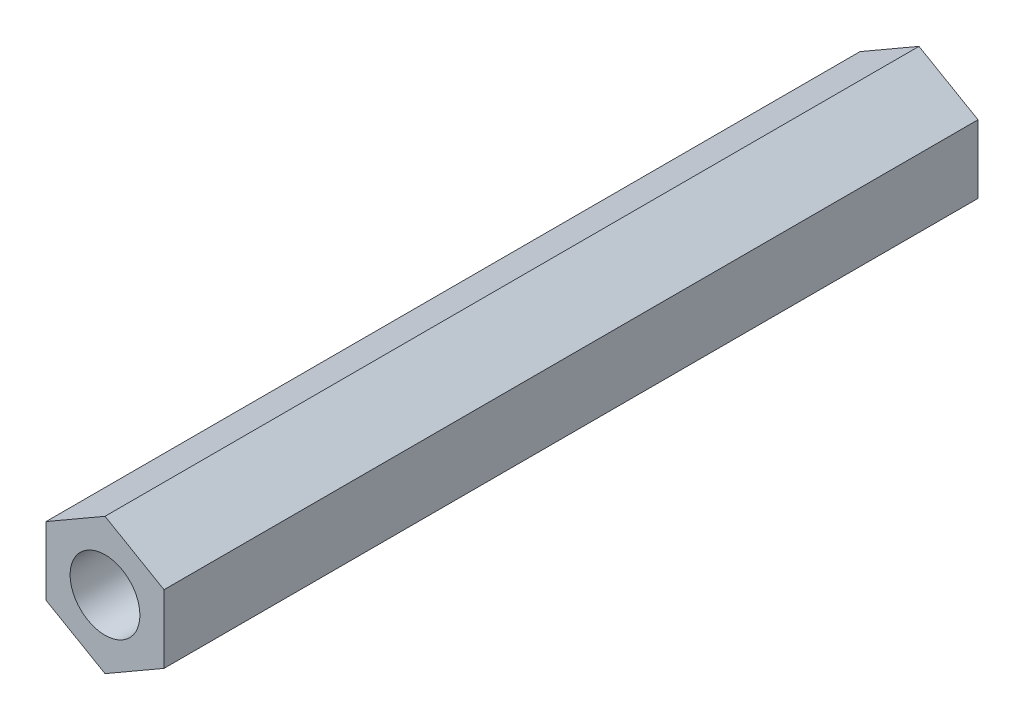
ISO-10303-21;
HEADER;
FILE_DESCRIPTION(('STEP AP214'),'2;1');
FILE_NAME('part.step','',(''),(''),'','','');
FILE_SCHEMA(('AUTOMOTIVE_DESIGN { 1 0 10303 214 1 1 1 1 }'));
ENDSEC;
DATA;
#1=APPLICATION_CONTEXT('core data for automotive mechanical design processes');
#2=APPLICATION_PROTOCOL_DEFINITION('international standard','automotive_design',2000,#1);
#3=PRODUCT_CONTEXT('',#1,'mechanical');
#4=PRODUCT('Part','Part','',(#3));
#5=PRODUCT_RELATED_PRODUCT_CATEGORY('part','',(#4));
#6=PRODUCT_DEFINITION_FORMATION('','',#4);
#7=PRODUCT_DEFINITION_CONTEXT('part definition',#1,'design');
#8=PRODUCT_DEFINITION('design','',#6,#7);
#9=PRODUCT_DEFINITION_SHAPE('','',#8);
#10=(LENGTH_UNIT() NAMED_UNIT(*) SI_UNIT(.MILLI.,.METRE.));
#11=(NAMED_UNIT(*) PLANE_ANGLE_UNIT() SI_UNIT($,.RADIAN.));
#12=(NAMED_UNIT(*) SI_UNIT($,.STERADIAN.) SOLID_ANGLE_UNIT());
#13=UNCERTAINTY_MEASURE_WITH_UNIT(LENGTH_MEASURE(1.E-05),#10,'distance_accuracy_value','');
#14=(GEOMETRIC_REPRESENTATION_CONTEXT(3) GLOBAL_UNCERTAINTY_ASSIGNED_CONTEXT((#13)) GLOBAL_UNIT_ASSIGNED_CONTEXT((#10,
#11,#12)) REPRESENTATION_CONTEXT('',''));
#15=CARTESIAN_POINT('',(0.,0.,0.));
#16=DIRECTION('',(0.,0.,1.));
#17=DIRECTION('',(1.,0.,0.));
#18=AXIS2_PLACEMENT_3D('',#15,#16,#17);
#19=CARTESIAN_POINT('',(0.,0.,-35.));
#20=DIRECTION('',(0.,0.,-1.));
#21=DIRECTION('',(1.,0.,0.));
#22=AXIS2_PLACEMENT_3D('',#19,#20,#21);
#23=PLANE('',#22);
#24=DIRECTION('',(0.866025403784439,0.5,0.));
#25=VECTOR('',#24,1.);
#26=CARTESIAN_POINT('',(0.,-2.93,-35.));
#27=LINE('',#26,#25);
#28=CARTESIAN_POINT('',(0.,-2.93,-35.));
#29=VERTEX_POINT('',#28);
#30=CARTESIAN_POINT('',(2.53745443308841,-1.465,-35.));
#31=VERTEX_POINT('',#30);
#32=EDGE_CURVE('E151',#29,#31,#27,.T.);
#33=ORIENTED_EDGE('',*,*,#32,.F.);
#34=DIRECTION('',(0.866025403784439,-0.5,0.));
#35=VECTOR('',#34,1.);
#36=CARTESIAN_POINT('',(-2.5374544330884,-1.465,-35.));
#37=LINE('',#36,#35);
#38=CARTESIAN_POINT('',(-2.5374544330884,-1.465,-35.));
#39=VERTEX_POINT('',#38);
#40=EDGE_CURVE('E122',#39,#29,#37,.T.);
#41=ORIENTED_EDGE('',*,*,#40,.F.);
#42=DIRECTION('',(0.,-1.,0.));
#43=VECTOR('',#42,1.);
#44=CARTESIAN_POINT('',(-2.5374544330884,1.465,-35.));
#45=LINE('',#44,#43);
#46=CARTESIAN_POINT('',(-2.5374544330884,1.465,-35.));
#47=VERTEX_POINT('',#46);
#48=EDGE_CURVE('E101',#47,#39,#45,.T.);
#49=ORIENTED_EDGE('',*,*,#48,.F.);
#50=DIRECTION('',(-0.866025403784439,-0.5,0.));
#51=VECTOR('',#50,1.);
#52=CARTESIAN_POINT('',(0.,2.93,-35.));
#53=LINE('',#52,#51);
#54=CARTESIAN_POINT('',(0.,2.93,-35.));
#55=VERTEX_POINT('',#54);
#56=EDGE_CURVE('E112',#55,#47,#53,.T.);
#57=ORIENTED_EDGE('',*,*,#56,.F.);
#58=DIRECTION('',(-0.866025403784439,0.5,0.));
#59=VECTOR('',#58,1.);
#60=CARTESIAN_POINT('',(2.53745443308841,1.465,-35.));
#61=LINE('',#60,#59);
#62=CARTESIAN_POINT('',(2.53745443308841,1.465,-35.));
#63=VERTEX_POINT('',#62);
#64=EDGE_CURVE('E118',#63,#55,#61,.T.);
#65=ORIENTED_EDGE('',*,*,#64,.F.);
#66=DIRECTION('',(0.,1.,0.));
#67=VECTOR('',#66,1.);
#68=CARTESIAN_POINT('',(2.53745443308841,-1.465,-35.));
#69=LINE('',#68,#67);
#70=EDGE_CURVE('E159',#31,#63,#69,.T.);
#71=ORIENTED_EDGE('',*,*,#70,.F.);
#72=EDGE_LOOP('',(#33,#41,#49,#57,#65,#71));
#73=FACE_BOUND('',#72,.T.);
#74=CARTESIAN_POINT('',(0.,0.,-35.));
#75=DIRECTION('',(0.,0.,1.));
#76=DIRECTION('',(1.,0.,0.));
#77=AXIS2_PLACEMENT_3D('',#74,#75,#76);
#78=CIRCLE('',#77,1.5);
#79=CARTESIAN_POINT('',(1.5,0.,-35.));
#80=VERTEX_POINT('',#79);
#81=EDGE_CURVE('E136',#80,#80,#78,.T.);
#82=ORIENTED_EDGE('',*,*,#81,.T.);
#83=EDGE_LOOP('',(#82));
#84=FACE_BOUND('',#83,.T.);
#85=ADVANCED_FACE('F39',(#73,#84),#23,.T.);
#86=CARTESIAN_POINT('',(0.,0.,0.));
#87=DIRECTION('',(0.,0.,-1.));
#88=DIRECTION('',(1.,0.,0.));
#89=AXIS2_PLACEMENT_3D('',#86,#87,#88);
#90=PLANE('',#89);
#91=DIRECTION('',(0.866025403784439,0.5,0.));
#92=VECTOR('',#91,1.);
#93=CARTESIAN_POINT('',(0.,-2.93,0.));
#94=LINE('',#93,#92);
#95=CARTESIAN_POINT('',(0.,-2.93,0.));
#96=VERTEX_POINT('',#95);
#97=CARTESIAN_POINT('',(2.53745443308841,-1.465,0.));
#98=VERTEX_POINT('',#97);
#99=EDGE_CURVE('E131',#96,#98,#94,.T.);
#100=ORIENTED_EDGE('',*,*,#99,.T.);
#101=DIRECTION('',(0.,1.,0.));
#102=VECTOR('',#101,1.);
#103=CARTESIAN_POINT('',(2.53745443308841,-1.465,0.));
#104=LINE('',#103,#102);
#105=CARTESIAN_POINT('',(2.53745443308841,1.465,0.));
#106=VERTEX_POINT('',#105);
#107=EDGE_CURVE('E135',#98,#106,#104,.T.);
#108=ORIENTED_EDGE('',*,*,#107,.T.);
#109=DIRECTION('',(-0.866025403784439,0.5,0.));
#110=VECTOR('',#109,1.);
#111=CARTESIAN_POINT('',(2.53745443308841,1.465,0.));
#112=LINE('',#111,#110);
#113=CARTESIAN_POINT('',(0.,2.93,0.));
#114=VERTEX_POINT('',#113);
#115=EDGE_CURVE('E140',#106,#114,#112,.T.);
#116=ORIENTED_EDGE('',*,*,#115,.T.);
#117=DIRECTION('',(-0.866025403784439,-0.5,0.));
#118=VECTOR('',#117,1.);
#119=CARTESIAN_POINT('',(0.,2.93,0.));
#120=LINE('',#119,#118);
#121=CARTESIAN_POINT('',(-2.5374544330884,1.465,0.));
#122=VERTEX_POINT('',#121);
#123=EDGE_CURVE('E144',#114,#122,#120,.T.);
#124=ORIENTED_EDGE('',*,*,#123,.T.);
#125=DIRECTION('',(0.,-1.,0.));
#126=VECTOR('',#125,1.);
#127=CARTESIAN_POINT('',(-2.5374544330884,1.465,0.));
#128=LINE('',#127,#126);
#129=CARTESIAN_POINT('',(-2.5374544330884,-1.465,0.));
#130=VERTEX_POINT('',#129);
#131=EDGE_CURVE('E104',#122,#130,#128,.T.);
#132=ORIENTED_EDGE('',*,*,#131,.T.);
#133=DIRECTION('',(0.866025403784439,-0.5,0.));
#134=VECTOR('',#133,1.);
#135=CARTESIAN_POINT('',(-2.5374544330884,-1.465,0.));
#136=LINE('',#135,#134);
#137=EDGE_CURVE('E148',#130,#96,#136,.T.);
#138=ORIENTED_EDGE('',*,*,#137,.T.);
#139=EDGE_LOOP('',(#100,#108,#116,#124,#132,#138));
#140=FACE_BOUND('',#139,.T.);
#141=CARTESIAN_POINT('',(0.,0.,0.));
#142=DIRECTION('',(0.,0.,1.));
#143=DIRECTION('',(1.,0.,0.));
#144=AXIS2_PLACEMENT_3D('',#141,#142,#143);
#145=CIRCLE('',#144,1.5);
#146=CARTESIAN_POINT('',(1.5,0.,0.));
#147=VERTEX_POINT('',#146);
#148=EDGE_CURVE('E170',#147,#147,#145,.T.);
#149=ORIENTED_EDGE('',*,*,#148,.F.);
#150=EDGE_LOOP('',(#149));
#151=FACE_BOUND('',#150,.T.);
#152=ADVANCED_FACE('F163',(#140,#151),#90,.F.);
#153=CARTESIAN_POINT('',(0.,-2.93,-35.));
#154=DIRECTION('',(-0.5,0.866025403784439,0.));
#155=DIRECTION('',(-0.866025403784439,-0.5,0.));
#156=AXIS2_PLACEMENT_3D('',#153,#154,#155);
#157=PLANE('',#156);
#158=ORIENTED_EDGE('',*,*,#99,.F.);
#159=DIRECTION('',(0.,0.,1.));
#160=VECTOR('',#159,1.);
#161=CARTESIAN_POINT('',(0.,-2.93,-35.));
#162=LINE('',#161,#160);
#163=EDGE_CURVE('E57',#29,#96,#162,.T.);
#164=ORIENTED_EDGE('',*,*,#163,.F.);
#165=ORIENTED_EDGE('',*,*,#32,.T.);
#166=DIRECTION('',(0.,0.,1.));
#167=VECTOR('',#166,1.);
#168=CARTESIAN_POINT('',(2.53745443308841,-1.465,-35.));
#169=LINE('',#168,#167);
#170=EDGE_CURVE('E11',#31,#98,#169,.T.);
#171=ORIENTED_EDGE('',*,*,#170,.T.);
#172=EDGE_LOOP('',(#158,#164,#165,#171));
#173=FACE_BOUND('',#172,.T.);
#174=ADVANCED_FACE('F41',(#173),#157,.F.);
#175=CARTESIAN_POINT('',(2.53745443308841,-1.465,-35.));
#176=DIRECTION('',(-1.,0.,0.));
#177=DIRECTION('',(0.,-1.,0.));
#178=AXIS2_PLACEMENT_3D('',#175,#176,#177);
#179=PLANE('',#178);
#180=ORIENTED_EDGE('',*,*,#107,.F.);
#181=ORIENTED_EDGE('',*,*,#170,.F.);
#182=ORIENTED_EDGE('',*,*,#70,.T.);
#183=DIRECTION('',(0.,0.,1.));
#184=VECTOR('',#183,1.);
#185=CARTESIAN_POINT('',(2.53745443308841,1.465,-35.));
#186=LINE('',#185,#184);
#187=EDGE_CURVE('E49',#63,#106,#186,.T.);
#188=ORIENTED_EDGE('',*,*,#187,.T.);
#189=EDGE_LOOP('',(#180,#181,#182,#188));
#190=FACE_BOUND('',#189,.T.);
#191=ADVANCED_FACE('F158',(#190),#179,.F.);
#192=CARTESIAN_POINT('',(2.53745443308841,1.465,-35.));
#193=DIRECTION('',(-0.5,-0.866025403784439,0.));
#194=DIRECTION('',(0.866025403784439,-0.5,0.));
#195=AXIS2_PLACEMENT_3D('',#192,#193,#194);
#196=PLANE('',#195);
#197=ORIENTED_EDGE('',*,*,#115,.F.);
#198=ORIENTED_EDGE('',*,*,#187,.F.);
#199=ORIENTED_EDGE('',*,*,#64,.T.);
#200=DIRECTION('',(0.,0.,1.));
#201=VECTOR('',#200,1.);
#202=CARTESIAN_POINT('',(0.,2.93,-35.));
#203=LINE('',#202,#201);
#204=EDGE_CURVE('E109',#55,#114,#203,.T.);
#205=ORIENTED_EDGE('',*,*,#204,.T.);
#206=EDGE_LOOP('',(#197,#198,#199,#205));
#207=FACE_BOUND('',#206,.T.);
#208=ADVANCED_FACE('F161',(#207),#196,.F.);
#209=CARTESIAN_POINT('',(0.,2.93,-35.));
#210=DIRECTION('',(0.5,-0.866025403784439,0.));
#211=DIRECTION('',(0.866025403784439,0.5,0.));
#212=AXIS2_PLACEMENT_3D('',#209,#210,#211);
#213=PLANE('',#212);
#214=ORIENTED_EDGE('',*,*,#123,.F.);
#215=ORIENTED_EDGE('',*,*,#204,.F.);
#216=ORIENTED_EDGE('',*,*,#56,.T.);
#217=DIRECTION('',(0.,0.,1.));
#218=VECTOR('',#217,1.);
#219=CARTESIAN_POINT('',(-2.5374544330884,1.465,-35.));
#220=LINE('',#219,#218);
#221=EDGE_CURVE('E97',#47,#122,#220,.T.);
#222=ORIENTED_EDGE('',*,*,#221,.T.);
#223=EDGE_LOOP('',(#214,#215,#216,#222));
#224=FACE_BOUND('',#223,.T.);
#225=ADVANCED_FACE('F113',(#224),#213,.F.);
#226=CARTESIAN_POINT('',(-2.5374544330884,1.465,-35.));
#227=DIRECTION('',(1.,0.,0.));
#228=DIRECTION('',(0.,1.,0.));
#229=AXIS2_PLACEMENT_3D('',#226,#227,#228);
#230=PLANE('',#229);
#231=ORIENTED_EDGE('',*,*,#131,.F.);
#232=ORIENTED_EDGE('',*,*,#221,.F.);
#233=ORIENTED_EDGE('',*,*,#48,.T.);
#234=DIRECTION('',(0.,0.,1.));
#235=VECTOR('',#234,1.);
#236=CARTESIAN_POINT('',(-2.5374544330884,-1.465,-35.));
#237=LINE('',#236,#235);
#238=EDGE_CURVE('E79',#39,#130,#237,.T.);
#239=ORIENTED_EDGE('',*,*,#238,.T.);
#240=EDGE_LOOP('',(#231,#232,#233,#239));
#241=FACE_BOUND('',#240,.T.);
#242=ADVANCED_FACE('F99',(#241),#230,.F.);
#243=CARTESIAN_POINT('',(-2.5374544330884,-1.465,-35.));
#244=DIRECTION('',(0.5,0.866025403784439,0.));
#245=DIRECTION('',(-0.866025403784439,0.5,0.));
#246=AXIS2_PLACEMENT_3D('',#243,#244,#245);
#247=PLANE('',#246);
#248=ORIENTED_EDGE('',*,*,#137,.F.);
#249=ORIENTED_EDGE('',*,*,#238,.F.);
#250=ORIENTED_EDGE('',*,*,#40,.T.);
#251=ORIENTED_EDGE('',*,*,#163,.T.);
#252=EDGE_LOOP('',(#248,#249,#250,#251));
#253=FACE_BOUND('',#252,.T.);
#254=ADVANCED_FACE('F182',(#253),#247,.F.);
#255=CARTESIAN_POINT('',(0.,0.,-35.));
#256=DIRECTION('',(0.,0.,1.));
#257=DIRECTION('',(-1.,0.,0.));
#258=AXIS2_PLACEMENT_3D('',#255,#256,#257);
#259=CYLINDRICAL_SURFACE('',#258,1.5);
#260=ORIENTED_EDGE('',*,*,#81,.F.);
#261=EDGE_LOOP('',(#260));
#262=FACE_BOUND('',#261,.T.);
#263=ORIENTED_EDGE('',*,*,#148,.T.);
#264=EDGE_LOOP('',(#263));
#265=FACE_BOUND('',#264,.T.);
#266=ADVANCED_FACE('F179',(#262,#265),#259,.F.);
#267=CLOSED_SHELL('',(#85,#152,#174,#191,#208,#225,#242,#254,#266));
#268=MANIFOLD_SOLID_BREP('B2',#267);
#269=ADVANCED_BREP_SHAPE_REPRESENTATION('',(#18,#268),#14);
#270=SHAPE_DEFINITION_REPRESENTATION(#9,#269);
ENDSEC;
END-ISO-10303-21;
